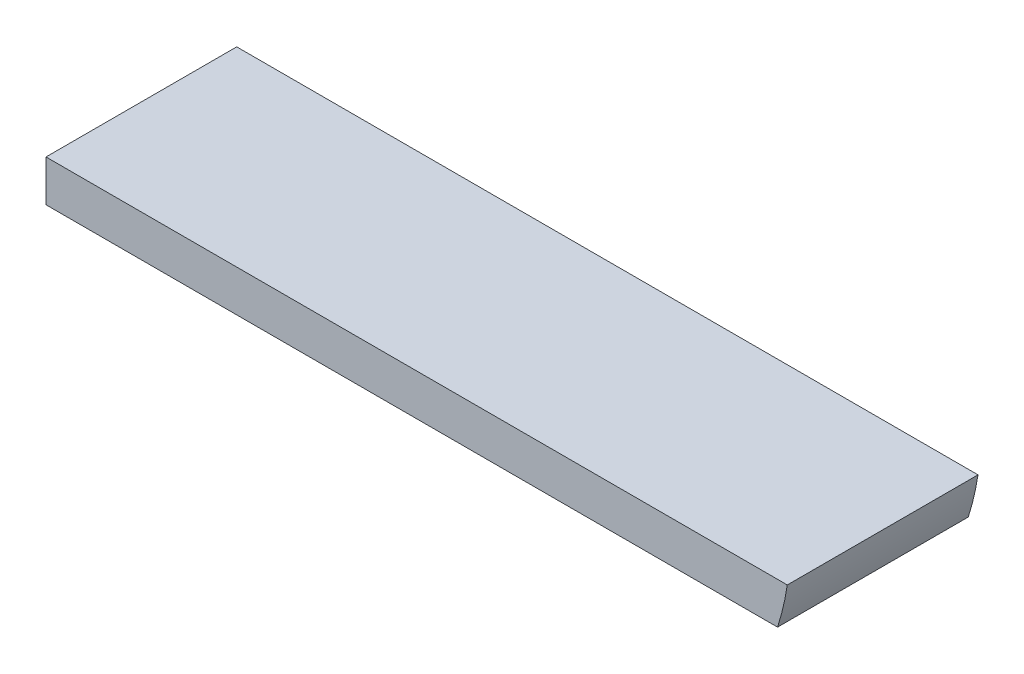
ISO-10303-21;
HEADER;
FILE_DESCRIPTION(('STEP AP214'),'2;1');
FILE_NAME('part.step','',(''),(''),'','','');
FILE_SCHEMA(('AUTOMOTIVE_DESIGN { 1 0 10303 214 1 1 1 1 }'));
ENDSEC;
DATA;
#1=APPLICATION_CONTEXT('core data for automotive mechanical design processes');
#2=APPLICATION_PROTOCOL_DEFINITION('international standard','automotive_design',2000,#1);
#3=PRODUCT_CONTEXT('',#1,'mechanical');
#4=PRODUCT('Part','Part','',(#3));
#5=PRODUCT_RELATED_PRODUCT_CATEGORY('part','',(#4));
#6=PRODUCT_DEFINITION_FORMATION('','',#4);
#7=PRODUCT_DEFINITION_CONTEXT('part definition',#1,'design');
#8=PRODUCT_DEFINITION('design','',#6,#7);
#9=PRODUCT_DEFINITION_SHAPE('','',#8);
#10=(LENGTH_UNIT() NAMED_UNIT(*) SI_UNIT(.MILLI.,.METRE.));
#11=(NAMED_UNIT(*) PLANE_ANGLE_UNIT() SI_UNIT($,.RADIAN.));
#12=(NAMED_UNIT(*) SI_UNIT($,.STERADIAN.) SOLID_ANGLE_UNIT());
#13=UNCERTAINTY_MEASURE_WITH_UNIT(LENGTH_MEASURE(1.E-05),#10,'distance_accuracy_value','');
#14=(GEOMETRIC_REPRESENTATION_CONTEXT(3) GLOBAL_UNCERTAINTY_ASSIGNED_CONTEXT((#13)) GLOBAL_UNIT_ASSIGNED_CONTEXT((#10,
#11,#12)) REPRESENTATION_CONTEXT('',''));
#15=CARTESIAN_POINT('',(0.,0.,0.));
#16=DIRECTION('',(0.,0.,1.));
#17=DIRECTION('',(1.,0.,0.));
#18=AXIS2_PLACEMENT_3D('',#15,#16,#17);
#19=CARTESIAN_POINT('',(-27.120912466168,5.968606226117,0.));
#20=DIRECTION('',(0.,-1.,0.));
#21=DIRECTION('',(1.,0.,0.));
#22=AXIS2_PLACEMENT_3D('',#19,#20,#21);
#23=PLANE('',#22);
#24=DIRECTION('',(-1.,0.,0.));
#25=VECTOR('',#24,1.);
#26=CARTESIAN_POINT('',(-26.73730002251,5.968606226117,0.));
#27=LINE('',#26,#25);
#28=CARTESIAN_POINT('',(-26.73730002251,5.968606226117,0.));
#29=VERTEX_POINT('',#28);
#30=CARTESIAN_POINT('',(-27.120912466168,5.968606226117,0.));
#31=VERTEX_POINT('',#30);
#32=EDGE_CURVE('E11',#29,#31,#27,.T.);
#33=ORIENTED_EDGE('',*,*,#32,.F.);
#34=DIRECTION('',(0.,0.,1.));
#35=VECTOR('',#34,1.);
#36=CARTESIAN_POINT('',(-26.73730002251,5.968606226117,0.));
#37=LINE('',#36,#35);
#38=CARTESIAN_POINT('',(-26.73730002251,5.968606226117,0.1));
#39=VERTEX_POINT('',#38);
#40=EDGE_CURVE('E24',#29,#39,#37,.T.);
#41=ORIENTED_EDGE('',*,*,#40,.T.);
#42=DIRECTION('',(1.,0.,0.));
#43=VECTOR('',#42,1.);
#44=CARTESIAN_POINT('',(-26.73730002251,5.968606226117,0.1));
#45=LINE('',#44,#43);
#46=CARTESIAN_POINT('',(-27.120912466168,5.968606226117,0.1));
#47=VERTEX_POINT('',#46);
#48=EDGE_CURVE('E75',#47,#39,#45,.T.);
#49=ORIENTED_EDGE('',*,*,#48,.F.);
#50=DIRECTION('',(0.,0.,1.));
#51=VECTOR('',#50,1.);
#52=CARTESIAN_POINT('',(-27.120912466168,5.968606226117,0.));
#53=LINE('',#52,#51);
#54=EDGE_CURVE('E85',#31,#47,#53,.T.);
#55=ORIENTED_EDGE('',*,*,#54,.F.);
#56=EDGE_LOOP('',(#33,#41,#49,#55));
#57=FACE_BOUND('',#56,.T.);
#58=ADVANCED_FACE('F17',(#57),#23,.T.);
#59=CARTESIAN_POINT('',(-27.120912466168,5.990335362914,0.));
#60=DIRECTION('',(-1.,0.,0.));
#61=DIRECTION('',(0.,-1.,0.));
#62=AXIS2_PLACEMENT_3D('',#59,#60,#61);
#63=PLANE('',#62);
#64=DIRECTION('',(0.,1.,0.));
#65=VECTOR('',#64,1.);
#66=CARTESIAN_POINT('',(-27.120912466168,5.968606226117,0.));
#67=LINE('',#66,#65);
#68=CARTESIAN_POINT('',(-27.120912466168,5.990335362914,0.));
#69=VERTEX_POINT('',#68);
#70=EDGE_CURVE('E83',#31,#69,#67,.T.);
#71=ORIENTED_EDGE('',*,*,#70,.F.);
#72=ORIENTED_EDGE('',*,*,#54,.T.);
#73=DIRECTION('',(0.,-1.,0.));
#74=VECTOR('',#73,1.);
#75=CARTESIAN_POINT('',(-27.120912466168,5.968606226117,0.1));
#76=LINE('',#75,#74);
#77=CARTESIAN_POINT('',(-27.120912466168,5.990335362914,0.1));
#78=VERTEX_POINT('',#77);
#79=EDGE_CURVE('E81',#78,#47,#76,.T.);
#80=ORIENTED_EDGE('',*,*,#79,.F.);
#81=DIRECTION('',(0.,0.,1.));
#82=VECTOR('',#81,1.);
#83=CARTESIAN_POINT('',(-27.120912466168,5.990335362914,0.));
#84=LINE('',#83,#82);
#85=EDGE_CURVE('E61',#69,#78,#84,.T.);
#86=ORIENTED_EDGE('',*,*,#85,.F.);
#87=EDGE_LOOP('',(#71,#72,#80,#86));
#88=FACE_BOUND('',#87,.T.);
#89=ADVANCED_FACE('F91',(#88),#63,.T.);
#90=CARTESIAN_POINT('',(-26.732190753688,5.990335362914,0.));
#91=DIRECTION('',(0.,1.,0.));
#92=DIRECTION('',(-1.,0.,0.));
#93=AXIS2_PLACEMENT_3D('',#90,#91,#92);
#94=PLANE('',#93);
#95=DIRECTION('',(1.,0.,0.));
#96=VECTOR('',#95,1.);
#97=CARTESIAN_POINT('',(-27.120912466168,5.990335362914,0.));
#98=LINE('',#97,#96);
#99=CARTESIAN_POINT('',(-26.732190753688,5.990335362914,0.));
#100=VERTEX_POINT('',#99);
#101=EDGE_CURVE('E65',#69,#100,#98,.T.);
#102=ORIENTED_EDGE('',*,*,#101,.F.);
#103=ORIENTED_EDGE('',*,*,#85,.T.);
#104=DIRECTION('',(-1.,0.,0.));
#105=VECTOR('',#104,1.);
#106=CARTESIAN_POINT('',(-27.120912466168,5.990335362914,0.1));
#107=LINE('',#106,#105);
#108=CARTESIAN_POINT('',(-26.732190753688,5.990335362914,0.1));
#109=VERTEX_POINT('',#108);
#110=EDGE_CURVE('E54',#109,#78,#107,.T.);
#111=ORIENTED_EDGE('',*,*,#110,.F.);
#112=DIRECTION('',(0.,0.,1.));
#113=VECTOR('',#112,1.);
#114=CARTESIAN_POINT('',(-26.732190753688,5.990335362914,0.));
#115=LINE('',#114,#113);
#116=EDGE_CURVE('E58',#100,#109,#115,.T.);
#117=ORIENTED_EDGE('',*,*,#116,.F.);
#118=EDGE_LOOP('',(#102,#103,#111,#117));
#119=FACE_BOUND('',#118,.T.);
#120=ADVANCED_FACE('F57',(#119),#94,.T.);
#121=CARTESIAN_POINT('',(-26.871812170946,6.011699918327,0.));
#122=DIRECTION('',(0.,0.,1.));
#123=DIRECTION('',(-0.952321739829089,0.305095565108537,0.));
#124=AXIS2_PLACEMENT_3D('',#121,#122,#123);
#125=CYLINDRICAL_SURFACE('',#124,0.141246537604029);
#126=CARTESIAN_POINT('',(-26.871812170946,6.011699918327,0.));
#127=DIRECTION('',(0.,0.,-1.));
#128=DIRECTION('',(-0.952321739829089,0.305095565108537,0.));
#129=AXIS2_PLACEMENT_3D('',#126,#127,#128);
#130=CIRCLE('',#129,0.141246537604029);
#131=EDGE_CURVE('E71',#100,#29,#130,.T.);
#132=ORIENTED_EDGE('',*,*,#131,.F.);
#133=ORIENTED_EDGE('',*,*,#116,.T.);
#134=CARTESIAN_POINT('',(-26.871812170946,6.011699918327,0.1));
#135=DIRECTION('',(0.,0.,1.));
#136=DIRECTION('',(-0.952321739829089,0.305095565108537,0.));
#137=AXIS2_PLACEMENT_3D('',#134,#135,#136);
#138=CIRCLE('',#137,0.141246537604029);
#139=EDGE_CURVE('E70',#39,#109,#138,.T.);
#140=ORIENTED_EDGE('',*,*,#139,.F.);
#141=ORIENTED_EDGE('',*,*,#40,.F.);
#142=EDGE_LOOP('',(#132,#133,#140,#141));
#143=FACE_BOUND('',#142,.T.);
#144=ADVANCED_FACE('F69',(#143),#125,.T.);
#145=CARTESIAN_POINT('',(-26.928998562662,5.979537863131,0.));
#146=DIRECTION('',(0.,0.,1.));
#147=DIRECTION('',(1.,0.,0.));
#148=AXIS2_PLACEMENT_3D('',#145,#146,#147);
#149=PLANE('',#148);
#150=ORIENTED_EDGE('',*,*,#131,.T.);
#151=ORIENTED_EDGE('',*,*,#32,.T.);
#152=ORIENTED_EDGE('',*,*,#70,.T.);
#153=ORIENTED_EDGE('',*,*,#101,.T.);
#154=EDGE_LOOP('',(#150,#151,#152,#153));
#155=FACE_BOUND('',#154,.T.);
#156=ADVANCED_FACE('F88',(#155),#149,.F.);
#157=CARTESIAN_POINT('',(-26.928998562662,5.979537863131,0.1));
#158=DIRECTION('',(0.,0.,1.));
#159=DIRECTION('',(1.,0.,0.));
#160=AXIS2_PLACEMENT_3D('',#157,#158,#159);
#161=PLANE('',#160);
#162=ORIENTED_EDGE('',*,*,#139,.T.);
#163=ORIENTED_EDGE('',*,*,#110,.T.);
#164=ORIENTED_EDGE('',*,*,#79,.T.);
#165=ORIENTED_EDGE('',*,*,#48,.T.);
#166=EDGE_LOOP('',(#162,#163,#164,#165));
#167=FACE_BOUND('',#166,.T.);
#168=ADVANCED_FACE('F74',(#167),#161,.T.);
#169=CLOSED_SHELL('',(#58,#89,#120,#144,#156,#168));
#170=MANIFOLD_SOLID_BREP('B1',#169);
#171=ADVANCED_BREP_SHAPE_REPRESENTATION('',(#18,#170),#14);
#172=SHAPE_DEFINITION_REPRESENTATION(#9,#171);
ENDSEC;
END-ISO-10303-21;
